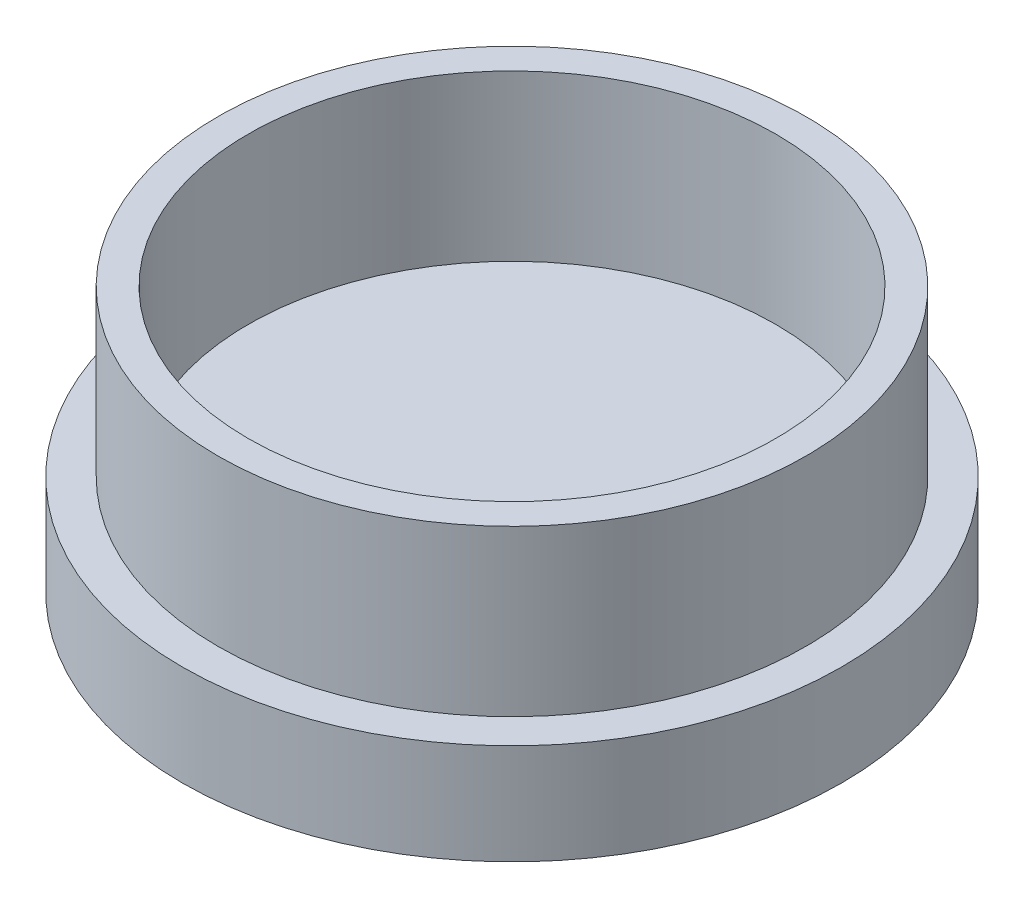
ISO-10303-21;
HEADER;
FILE_DESCRIPTION(('STEP AP214'),'2;1');
FILE_NAME('part.step','',(''),(''),'','','');
FILE_SCHEMA(('AUTOMOTIVE_DESIGN { 1 0 10303 214 1 1 1 1 }'));
ENDSEC;
DATA;
#1=APPLICATION_CONTEXT('core data for automotive mechanical design processes');
#2=APPLICATION_PROTOCOL_DEFINITION('international standard','automotive_design',2000,#1);
#3=PRODUCT_CONTEXT('',#1,'mechanical');
#4=PRODUCT('Part','Part','',(#3));
#5=PRODUCT_RELATED_PRODUCT_CATEGORY('part','',(#4));
#6=PRODUCT_DEFINITION_FORMATION('','',#4);
#7=PRODUCT_DEFINITION_CONTEXT('part definition',#1,'design');
#8=PRODUCT_DEFINITION('design','',#6,#7);
#9=PRODUCT_DEFINITION_SHAPE('','',#8);
#10=(LENGTH_UNIT() NAMED_UNIT(*) SI_UNIT(.MILLI.,.METRE.));
#11=(NAMED_UNIT(*) PLANE_ANGLE_UNIT() SI_UNIT($,.RADIAN.));
#12=(NAMED_UNIT(*) SI_UNIT($,.STERADIAN.) SOLID_ANGLE_UNIT());
#13=UNCERTAINTY_MEASURE_WITH_UNIT(LENGTH_MEASURE(1.E-05),#10,'distance_accuracy_value','');
#14=(GEOMETRIC_REPRESENTATION_CONTEXT(3) GLOBAL_UNCERTAINTY_ASSIGNED_CONTEXT((#13)) GLOBAL_UNIT_ASSIGNED_CONTEXT((#10,
#11,#12)) REPRESENTATION_CONTEXT('',''));
#15=CARTESIAN_POINT('',(0.,0.,0.));
#16=DIRECTION('',(0.,0.,1.));
#17=DIRECTION('',(1.,0.,0.));
#18=AXIS2_PLACEMENT_3D('',#15,#16,#17);
#19=CARTESIAN_POINT('',(0.,152.4,0.));
#20=DIRECTION('',(0.,-1.,0.));
#21=DIRECTION('',(0.,0.,-1.));
#22=AXIS2_PLACEMENT_3D('',#19,#20,#21);
#23=CYLINDRICAL_SURFACE('',#22,500.);
#24=CARTESIAN_POINT('',(0.,152.4,0.));
#25=DIRECTION('',(0.,1.,0.));
#26=DIRECTION('',(0.,0.,1.));
#27=AXIS2_PLACEMENT_3D('',#24,#25,#26);
#28=CIRCLE('',#27,500.);
#29=CARTESIAN_POINT('',(0.,152.4,-500.));
#30=VERTEX_POINT('',#29);
#31=EDGE_CURVE('E49',#30,#30,#28,.T.);
#32=CARTESIAN_POINT('',(0.,0.,0.));
#33=DIRECTION('',(0.,1.,0.));
#34=DIRECTION('',(0.,0.,1.));
#35=AXIS2_PLACEMENT_3D('',#32,#33,#34);
#36=CIRCLE('',#35,500.);
#37=CARTESIAN_POINT('',(0.,0.,-500.));
#38=VERTEX_POINT('',#37);
#39=EDGE_CURVE('E53',#38,#38,#36,.T.);
#40=CARTESIAN_POINT('',(0.,152.4,-500.));
#41=CARTESIAN_POINT('',(0.,150.8125,-500.));
#42=CARTESIAN_POINT('',(0.,149.225,-500.));
#43=CARTESIAN_POINT('',(0.,146.05,-500.));
#44=CARTESIAN_POINT('',(0.,144.4625,-500.));
#45=CARTESIAN_POINT('',(0.,141.2875,-500.));
#46=CARTESIAN_POINT('',(0.,139.7,-500.));
#47=CARTESIAN_POINT('',(0.,136.525,-500.));
#48=CARTESIAN_POINT('',(0.,134.9375,-500.));
#49=CARTESIAN_POINT('',(0.,131.7625,-500.));
#50=CARTESIAN_POINT('',(0.,130.175,-500.));
#51=CARTESIAN_POINT('',(0.,127.,-500.));
#52=CARTESIAN_POINT('',(0.,125.4125,-500.));
#53=CARTESIAN_POINT('',(0.,122.2375,-500.));
#54=CARTESIAN_POINT('',(0.,120.65,-500.));
#55=CARTESIAN_POINT('',(0.,117.475,-500.));
#56=CARTESIAN_POINT('',(0.,115.8875,-500.));
#57=CARTESIAN_POINT('',(0.,112.7125,-500.));
#58=CARTESIAN_POINT('',(0.,111.125,-500.));
#59=CARTESIAN_POINT('',(0.,107.95,-500.));
#60=CARTESIAN_POINT('',(0.,106.3625,-500.));
#61=CARTESIAN_POINT('',(0.,103.1875,-500.));
#62=CARTESIAN_POINT('',(0.,101.6,-500.));
#63=CARTESIAN_POINT('',(0.,98.425,-500.));
#64=CARTESIAN_POINT('',(0.,96.8375,-500.));
#65=CARTESIAN_POINT('',(0.,93.6625,-500.));
#66=CARTESIAN_POINT('',(0.,92.075,-500.));
#67=CARTESIAN_POINT('',(0.,88.9,-500.));
#68=CARTESIAN_POINT('',(0.,87.3125,-500.));
#69=CARTESIAN_POINT('',(0.,84.1375,-500.));
#70=CARTESIAN_POINT('',(0.,82.55,-500.));
#71=CARTESIAN_POINT('',(0.,79.375,-500.));
#72=CARTESIAN_POINT('',(0.,77.7875,-500.));
#73=CARTESIAN_POINT('',(0.,74.6125,-500.));
#74=CARTESIAN_POINT('',(0.,73.025,-500.));
#75=CARTESIAN_POINT('',(0.,69.85,-500.));
#76=CARTESIAN_POINT('',(0.,68.2625,-500.));
#77=CARTESIAN_POINT('',(0.,65.0875,-500.));
#78=CARTESIAN_POINT('',(0.,63.5,-500.));
#79=CARTESIAN_POINT('',(0.,60.325,-500.));
#80=CARTESIAN_POINT('',(0.,58.7375,-500.));
#81=CARTESIAN_POINT('',(0.,55.5625,-500.));
#82=CARTESIAN_POINT('',(0.,53.975,-500.));
#83=CARTESIAN_POINT('',(0.,50.8,-500.));
#84=CARTESIAN_POINT('',(0.,49.2125,-500.));
#85=CARTESIAN_POINT('',(0.,46.0375,-500.));
#86=CARTESIAN_POINT('',(0.,44.45,-500.));
#87=CARTESIAN_POINT('',(0.,41.275,-500.));
#88=CARTESIAN_POINT('',(0.,39.6875,-500.));
#89=CARTESIAN_POINT('',(0.,36.5125,-500.));
#90=CARTESIAN_POINT('',(0.,34.925,-500.));
#91=CARTESIAN_POINT('',(0.,31.75,-500.));
#92=CARTESIAN_POINT('',(0.,30.1625,-500.));
#93=CARTESIAN_POINT('',(0.,26.9875,-500.));
#94=CARTESIAN_POINT('',(0.,25.4,-500.));
#95=CARTESIAN_POINT('',(0.,22.225,-500.));
#96=CARTESIAN_POINT('',(0.,20.6375,-500.));
#97=CARTESIAN_POINT('',(0.,17.4625,-500.));
#98=CARTESIAN_POINT('',(0.,15.875,-500.));
#99=CARTESIAN_POINT('',(0.,12.7,-500.));
#100=CARTESIAN_POINT('',(0.,11.1125,-500.));
#101=CARTESIAN_POINT('',(0.,7.93750000000001,-500.));
#102=CARTESIAN_POINT('',(0.,6.35,-500.));
#103=CARTESIAN_POINT('',(0.,3.175,-500.));
#104=CARTESIAN_POINT('',(0.,1.5875,-500.));
#105=CARTESIAN_POINT('',(0.,0.,-500.));
#106=B_SPLINE_CURVE_WITH_KNOTS('',3,(#40,#41,#42,#43,#44,#45,#46,#47,#48,#49,#50,#51,#52,#53,
#54,#55,#56,#57,#58,#59,#60,#61,#62,#63,#64,#65,#66,#67,#68,#69,#70,#71,#72,#73,#74,#75,#76,#77,
#78,#79,#80,#81,#82,#83,#84,#85,#86,#87,#88,#89,#90,#91,#92,#93,#94,#95,#96,#97,#98,#99,#100,
#101,#102,#103,#104,#105),.UNSPECIFIED.,.F.,.F.,(4,2,2,2,2,2,2,2,2,2,2,2,2,2,2,2,2,2,2,2,2,2,2,
2,2,2,2,2,2,2,2,2,4),(0.,4.76249999999998,9.52499999999998,14.2875,19.05,23.8125,28.575,33.3375,
38.1,42.8625,47.625,52.3875,57.15,61.9125,66.675,71.4375,76.2,80.9625,85.725,90.4875,95.25,
100.0125,104.775,109.5375,114.3,119.0625,123.825,128.5875,133.35,138.1125,142.875,147.6375,
152.4),.UNSPECIFIED.);
#107=EDGE_CURVE('BSEAM43',#30,#38,#106,.T.);
#108=ORIENTED_EDGE('',*,*,#31,.F.);
#109=ORIENTED_EDGE('',*,*,#39,.T.);
#110=ORIENTED_EDGE('',*,*,#107,.T.);
#111=ORIENTED_EDGE('',*,*,#107,.F.);
#112=EDGE_LOOP('',(#108,#110,#109,#111));
#113=FACE_BOUND('',#112,.T.);
#114=ADVANCED_FACE('F43',(#113),#23,.T.);
#115=CARTESIAN_POINT('',(0.,152.4,0.));
#116=DIRECTION('',(0.,1.,0.));
#117=DIRECTION('',(0.,0.,1.));
#118=AXIS2_PLACEMENT_3D('',#115,#116,#117);
#119=PLANE('',#118);
#120=CARTESIAN_POINT('',(0.,152.4,0.));
#121=DIRECTION('',(0.,1.,0.));
#122=DIRECTION('',(0.,0.,1.));
#123=AXIS2_PLACEMENT_3D('',#120,#121,#122);
#124=CIRCLE('',#123,445.916770950693);
#125=CARTESIAN_POINT('',(0.,152.4,445.916770950693));
#126=VERTEX_POINT('',#125);
#127=EDGE_CURVE('E60',#126,#126,#124,.T.);
#128=ORIENTED_EDGE('',*,*,#127,.F.);
#129=EDGE_LOOP('',(#128));
#130=FACE_BOUND('',#129,.T.);
#131=ORIENTED_EDGE('',*,*,#31,.T.);
#132=EDGE_LOOP('',(#131));
#133=FACE_BOUND('',#132,.T.);
#134=ADVANCED_FACE('F84',(#130,#133),#119,.T.);
#135=CARTESIAN_POINT('',(0.,0.,0.));
#136=DIRECTION('',(0.,1.,0.));
#137=DIRECTION('',(0.,0.,1.));
#138=AXIS2_PLACEMENT_3D('',#135,#136,#137);
#139=PLANE('',#138);
#140=ORIENTED_EDGE('',*,*,#39,.F.);
#141=EDGE_LOOP('',(#140));
#142=FACE_BOUND('',#141,.T.);
#143=ADVANCED_FACE('F74',(#142),#139,.F.);
#144=CARTESIAN_POINT('',(0.,402.4,0.));
#145=DIRECTION('',(0.,1.,0.));
#146=DIRECTION('',(0.,0.,1.));
#147=AXIS2_PLACEMENT_3D('',#144,#145,#146);
#148=PLANE('',#147);
#149=CARTESIAN_POINT('',(0.,402.4,0.));
#150=DIRECTION('',(0.,1.,0.));
#151=DIRECTION('',(0.,0.,1.));
#152=AXIS2_PLACEMENT_3D('',#149,#150,#151);
#153=CIRCLE('',#152,445.916770950693);
#154=CARTESIAN_POINT('',(0.,402.4,445.916770950693));
#155=VERTEX_POINT('',#154);
#156=EDGE_CURVE('E58',#155,#155,#153,.T.);
#157=ORIENTED_EDGE('',*,*,#156,.T.);
#158=EDGE_LOOP('',(#157));
#159=FACE_BOUND('',#158,.T.);
#160=CARTESIAN_POINT('',(0.,402.4,0.));
#161=DIRECTION('',(0.,1.,0.));
#162=DIRECTION('',(0.,0.,1.));
#163=AXIS2_PLACEMENT_3D('',#160,#161,#162);
#164=CIRCLE('',#163,400.);
#165=CARTESIAN_POINT('',(0.,402.4,400.));
#166=VERTEX_POINT('',#165);
#167=EDGE_CURVE('E63',#166,#166,#164,.T.);
#168=ORIENTED_EDGE('',*,*,#167,.F.);
#169=EDGE_LOOP('',(#168));
#170=FACE_BOUND('',#169,.T.);
#171=ADVANCED_FACE('F71',(#159,#170),#148,.T.);
#172=CARTESIAN_POINT('',(0.,402.4,0.));
#173=DIRECTION('',(0.,-1.,0.));
#174=DIRECTION('',(0.,0.,-1.));
#175=AXIS2_PLACEMENT_3D('',#172,#173,#174);
#176=CYLINDRICAL_SURFACE('',#175,445.916770950693);
#177=ORIENTED_EDGE('',*,*,#156,.F.);
#178=EDGE_LOOP('',(#177));
#179=FACE_BOUND('',#178,.T.);
#180=ORIENTED_EDGE('',*,*,#127,.T.);
#181=EDGE_LOOP('',(#180));
#182=FACE_BOUND('',#181,.T.);
#183=ADVANCED_FACE('F73',(#179,#182),#176,.T.);
#184=CARTESIAN_POINT('',(0.,402.4,0.));
#185=DIRECTION('',(0.,-1.,0.));
#186=DIRECTION('',(0.,0.,-1.));
#187=AXIS2_PLACEMENT_3D('',#184,#185,#186);
#188=CYLINDRICAL_SURFACE('',#187,400.);
#189=ORIENTED_EDGE('',*,*,#167,.T.);
#190=EDGE_LOOP('',(#189));
#191=FACE_BOUND('',#190,.T.);
#192=CARTESIAN_POINT('',(0.,152.4,0.));
#193=DIRECTION('',(0.,1.,0.));
#194=DIRECTION('',(0.,0.,1.));
#195=AXIS2_PLACEMENT_3D('',#192,#193,#194);
#196=CIRCLE('',#195,400.);
#197=CARTESIAN_POINT('',(0.,152.4,400.));
#198=VERTEX_POINT('',#197);
#199=EDGE_CURVE('E11',#198,#198,#196,.F.);
#200=ORIENTED_EDGE('',*,*,#199,.T.);
#201=EDGE_LOOP('',(#200));
#202=FACE_BOUND('',#201,.T.);
#203=ADVANCED_FACE('F69',(#191,#202),#188,.F.);
#204=ORIENTED_EDGE('',*,*,#199,.F.);
#205=EDGE_LOOP('',(#204));
#206=FACE_BOUND('',#205,.T.);
#207=ADVANCED_FACE('F93',(#206),#119,.T.);
#208=CLOSED_SHELL('',(#114,#134,#143,#171,#183,#203,#207));
#209=MANIFOLD_SOLID_BREP('B2',#208);
#210=ADVANCED_BREP_SHAPE_REPRESENTATION('',(#18,#209),#14);
#211=SHAPE_DEFINITION_REPRESENTATION(#9,#210);
ENDSEC;
END-ISO-10303-21;
